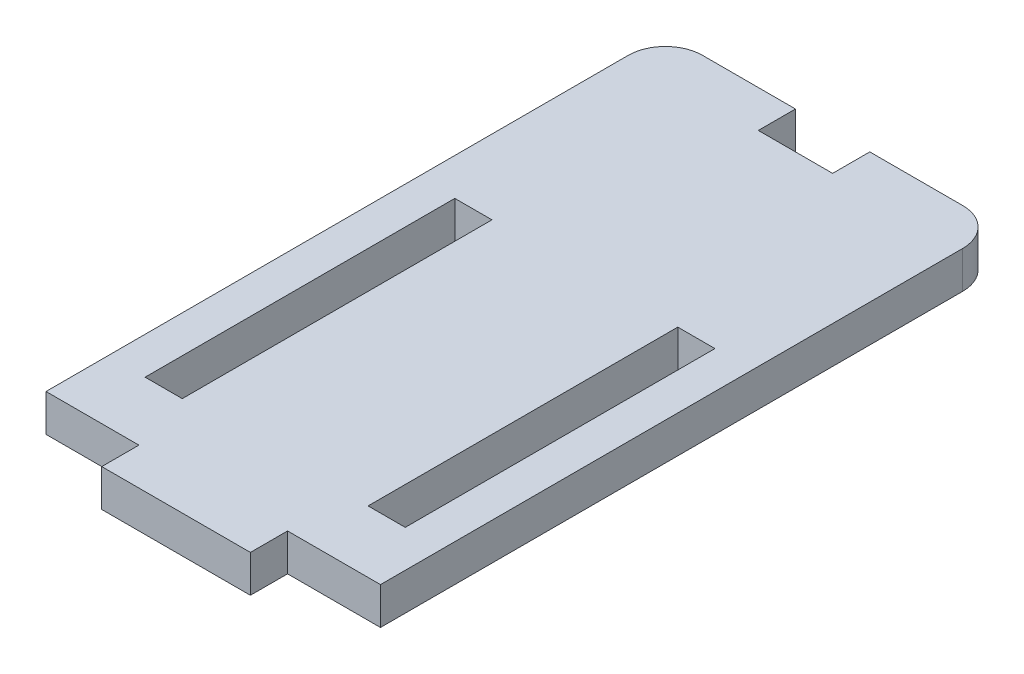
ISO-10303-21;
HEADER;
FILE_DESCRIPTION(('STEP AP214'),'2;1');
FILE_NAME('part.step','',(''),(''),'','','');
FILE_SCHEMA(('AUTOMOTIVE_DESIGN { 1 0 10303 214 1 1 1 1 }'));
ENDSEC;
DATA;
#1=APPLICATION_CONTEXT('core data for automotive mechanical design processes');
#2=APPLICATION_PROTOCOL_DEFINITION('international standard','automotive_design',2000,#1);
#3=PRODUCT_CONTEXT('',#1,'mechanical');
#4=PRODUCT('Part','Part','',(#3));
#5=PRODUCT_RELATED_PRODUCT_CATEGORY('part','',(#4));
#6=PRODUCT_DEFINITION_FORMATION('','',#4);
#7=PRODUCT_DEFINITION_CONTEXT('part definition',#1,'design');
#8=PRODUCT_DEFINITION('design','',#6,#7);
#9=PRODUCT_DEFINITION_SHAPE('','',#8);
#10=(LENGTH_UNIT() NAMED_UNIT(*) SI_UNIT(.MILLI.,.METRE.));
#11=(NAMED_UNIT(*) PLANE_ANGLE_UNIT() SI_UNIT($,.RADIAN.));
#12=(NAMED_UNIT(*) SI_UNIT($,.STERADIAN.) SOLID_ANGLE_UNIT());
#13=UNCERTAINTY_MEASURE_WITH_UNIT(LENGTH_MEASURE(1.E-05),#10,'distance_accuracy_value','');
#14=(GEOMETRIC_REPRESENTATION_CONTEXT(3) GLOBAL_UNCERTAINTY_ASSIGNED_CONTEXT((#13)) GLOBAL_UNIT_ASSIGNED_CONTEXT((#10,
#11,#12)) REPRESENTATION_CONTEXT('',''));
#15=CARTESIAN_POINT('',(0.,0.,0.));
#16=DIRECTION('',(0.,0.,1.));
#17=DIRECTION('',(1.,0.,0.));
#18=AXIS2_PLACEMENT_3D('',#15,#16,#17);
#19=CARTESIAN_POINT('',(-13.5,1.5,-25.));
#20=DIRECTION('',(0.,0.,1.));
#21=DIRECTION('',(1.,0.,0.));
#22=AXIS2_PLACEMENT_3D('',#19,#20,#21);
#23=PLANE('',#22);
#24=DIRECTION('',(-1.,0.,0.));
#25=VECTOR('',#24,1.);
#26=CARTESIAN_POINT('',(-13.5,1.5,-25.));
#27=LINE('',#26,#25);
#28=CARTESIAN_POINT('',(-3.,1.5,-25.));
#29=VERTEX_POINT('',#28);
#30=CARTESIAN_POINT('',(-10.5,1.5,-25.));
#31=VERTEX_POINT('',#30);
#32=EDGE_CURVE('E377',#29,#31,#27,.T.);
#33=ORIENTED_EDGE('',*,*,#32,.F.);
#34=DIRECTION('',(0.,1.,0.));
#35=VECTOR('',#34,1.);
#36=CARTESIAN_POINT('',(-3.,-1.5,-25.));
#37=LINE('',#36,#35);
#38=CARTESIAN_POINT('',(-3.,-1.5,-25.));
#39=VERTEX_POINT('',#38);
#40=EDGE_CURVE('E212',#39,#29,#37,.T.);
#41=ORIENTED_EDGE('',*,*,#40,.F.);
#42=DIRECTION('',(-1.,0.,0.));
#43=VECTOR('',#42,1.);
#44=CARTESIAN_POINT('',(-13.5,-1.5,-25.));
#45=LINE('',#44,#43);
#46=CARTESIAN_POINT('',(-10.5,-1.5,-25.));
#47=VERTEX_POINT('',#46);
#48=EDGE_CURVE('E393',#39,#47,#45,.T.);
#49=ORIENTED_EDGE('',*,*,#48,.T.);
#50=DIRECTION('',(0.,-1.,0.));
#51=VECTOR('',#50,1.);
#52=CARTESIAN_POINT('',(-10.5,1.5,-25.));
#53=LINE('',#52,#51);
#54=EDGE_CURVE('E404',#47,#31,#53,.F.);
#55=ORIENTED_EDGE('',*,*,#54,.T.);
#56=EDGE_LOOP('',(#33,#41,#49,#55));
#57=FACE_BOUND('',#56,.T.);
#58=ADVANCED_FACE('F45',(#57),#23,.F.);
#59=CARTESIAN_POINT('',(-13.5,1.5,25.));
#60=DIRECTION('',(0.,0.,-1.));
#61=DIRECTION('',(-1.,0.,0.));
#62=AXIS2_PLACEMENT_3D('',#59,#60,#61);
#63=PLANE('',#62);
#64=DIRECTION('',(0.,-1.,0.));
#65=VECTOR('',#64,1.);
#66=CARTESIAN_POINT('',(-6.0000000000001,1.5,25.));
#67=LINE('',#66,#65);
#68=CARTESIAN_POINT('',(-6.0000000000001,1.5,25.));
#69=VERTEX_POINT('',#68);
#70=CARTESIAN_POINT('',(-6.0000000000001,-1.5,25.));
#71=VERTEX_POINT('',#70);
#72=EDGE_CURVE('E340',#69,#71,#67,.T.);
#73=ORIENTED_EDGE('',*,*,#72,.F.);
#74=DIRECTION('',(1.,0.,0.));
#75=VECTOR('',#74,1.);
#76=CARTESIAN_POINT('',(-13.5,1.5,25.));
#77=LINE('',#76,#75);
#78=CARTESIAN_POINT('',(-13.5,1.5,25.));
#79=VERTEX_POINT('',#78);
#80=EDGE_CURVE('E369',#79,#69,#77,.T.);
#81=ORIENTED_EDGE('',*,*,#80,.F.);
#82=DIRECTION('',(0.,-1.,0.));
#83=VECTOR('',#82,1.);
#84=CARTESIAN_POINT('',(-13.5,1.5,25.));
#85=LINE('',#84,#83);
#86=CARTESIAN_POINT('',(-13.5,-1.5,25.));
#87=VERTEX_POINT('',#86);
#88=EDGE_CURVE('E400',#79,#87,#85,.T.);
#89=ORIENTED_EDGE('',*,*,#88,.T.);
#90=DIRECTION('',(1.,0.,0.));
#91=VECTOR('',#90,1.);
#92=CARTESIAN_POINT('',(-13.5,-1.5,25.));
#93=LINE('',#92,#91);
#94=EDGE_CURVE('E385',#87,#71,#93,.T.);
#95=ORIENTED_EDGE('',*,*,#94,.T.);
#96=EDGE_LOOP('',(#73,#81,#89,#95));
#97=FACE_BOUND('',#96,.T.);
#98=ADVANCED_FACE('F465',(#97),#63,.F.);
#99=CARTESIAN_POINT('',(-13.5,1.5,-25.));
#100=DIRECTION('',(1.,0.,0.));
#101=DIRECTION('',(0.,0.,-1.));
#102=AXIS2_PLACEMENT_3D('',#99,#100,#101);
#103=PLANE('',#102);
#104=DIRECTION('',(0.,0.,1.));
#105=VECTOR('',#104,1.);
#106=CARTESIAN_POINT('',(-13.5,1.5,-25.));
#107=LINE('',#106,#105);
#108=CARTESIAN_POINT('',(-13.5,1.5,-22.));
#109=VERTEX_POINT('',#108);
#110=EDGE_CURVE('E364',#109,#79,#107,.T.);
#111=ORIENTED_EDGE('',*,*,#110,.F.);
#112=DIRECTION('',(0.,-1.,0.));
#113=VECTOR('',#112,1.);
#114=CARTESIAN_POINT('',(-13.5,1.5,-22.));
#115=LINE('',#114,#113);
#116=CARTESIAN_POINT('',(-13.5,-1.5,-22.));
#117=VERTEX_POINT('',#116);
#118=EDGE_CURVE('E11',#109,#117,#115,.T.);
#119=ORIENTED_EDGE('',*,*,#118,.T.);
#120=DIRECTION('',(0.,0.,1.));
#121=VECTOR('',#120,1.);
#122=CARTESIAN_POINT('',(-13.5,-1.5,-25.));
#123=LINE('',#122,#121);
#124=EDGE_CURVE('E363',#117,#87,#123,.T.);
#125=ORIENTED_EDGE('',*,*,#124,.T.);
#126=ORIENTED_EDGE('',*,*,#88,.F.);
#127=EDGE_LOOP('',(#111,#119,#125,#126));
#128=FACE_BOUND('',#127,.T.);
#129=ADVANCED_FACE('F458',(#128),#103,.F.);
#130=CARTESIAN_POINT('',(6.0000000000001,1.5,25.));
#131=VERTEX_POINT('',#130);
#132=CARTESIAN_POINT('',(13.5,1.5,25.));
#133=VERTEX_POINT('',#132);
#134=EDGE_CURVE('E367',#131,#133,#77,.T.);
#135=ORIENTED_EDGE('',*,*,#134,.F.);
#136=DIRECTION('',(0.,-1.,0.));
#137=VECTOR('',#136,1.);
#138=CARTESIAN_POINT('',(6.0000000000001,1.5,25.));
#139=LINE('',#138,#137);
#140=CARTESIAN_POINT('',(6.0000000000001,-1.5,25.));
#141=VERTEX_POINT('',#140);
#142=EDGE_CURVE('E351',#131,#141,#139,.T.);
#143=ORIENTED_EDGE('',*,*,#142,.T.);
#144=CARTESIAN_POINT('',(13.5,-1.5,25.));
#145=VERTEX_POINT('',#144);
#146=EDGE_CURVE('E384',#141,#145,#93,.T.);
#147=ORIENTED_EDGE('',*,*,#146,.T.);
#148=DIRECTION('',(0.,-1.,0.));
#149=VECTOR('',#148,1.);
#150=CARTESIAN_POINT('',(13.5,1.5,25.));
#151=LINE('',#150,#149);
#152=EDGE_CURVE('E381',#133,#145,#151,.T.);
#153=ORIENTED_EDGE('',*,*,#152,.F.);
#154=EDGE_LOOP('',(#135,#143,#147,#153));
#155=FACE_BOUND('',#154,.T.);
#156=ADVANCED_FACE('F445',(#155),#63,.F.);
#157=CARTESIAN_POINT('',(13.5,1.5,-25.));
#158=DIRECTION('',(-1.,0.,0.));
#159=DIRECTION('',(0.,0.,1.));
#160=AXIS2_PLACEMENT_3D('',#157,#158,#159);
#161=PLANE('',#160);
#162=DIRECTION('',(0.,0.,-1.));
#163=VECTOR('',#162,1.);
#164=CARTESIAN_POINT('',(13.5,-1.5,-25.));
#165=LINE('',#164,#163);
#166=CARTESIAN_POINT('',(13.5,-1.5,-22.));
#167=VERTEX_POINT('',#166);
#168=EDGE_CURVE('E389',#145,#167,#165,.T.);
#169=ORIENTED_EDGE('',*,*,#168,.T.);
#170=DIRECTION('',(0.,-1.,0.));
#171=VECTOR('',#170,1.);
#172=CARTESIAN_POINT('',(13.5,1.5,-22.));
#173=LINE('',#172,#171);
#174=CARTESIAN_POINT('',(13.5,1.5,-22.));
#175=VERTEX_POINT('',#174);
#176=EDGE_CURVE('E419',#167,#175,#173,.F.);
#177=ORIENTED_EDGE('',*,*,#176,.T.);
#178=DIRECTION('',(0.,0.,-1.));
#179=VECTOR('',#178,1.);
#180=CARTESIAN_POINT('',(13.5,1.5,-25.));
#181=LINE('',#180,#179);
#182=EDGE_CURVE('E373',#133,#175,#181,.T.);
#183=ORIENTED_EDGE('',*,*,#182,.F.);
#184=ORIENTED_EDGE('',*,*,#152,.T.);
#185=EDGE_LOOP('',(#169,#177,#183,#184));
#186=FACE_BOUND('',#185,.T.);
#187=ADVANCED_FACE('F441',(#186),#161,.F.);
#188=CARTESIAN_POINT('',(10.5,-1.5,-25.));
#189=VERTEX_POINT('',#188);
#190=CARTESIAN_POINT('',(3.,-1.5,-25.));
#191=VERTEX_POINT('',#190);
#192=EDGE_CURVE('E368',#189,#191,#45,.T.);
#193=ORIENTED_EDGE('',*,*,#192,.T.);
#194=DIRECTION('',(0.,1.,0.));
#195=VECTOR('',#194,1.);
#196=CARTESIAN_POINT('',(3.,-1.5,-25.));
#197=LINE('',#196,#195);
#198=CARTESIAN_POINT('',(3.,1.5,-25.));
#199=VERTEX_POINT('',#198);
#200=EDGE_CURVE('E235',#191,#199,#197,.T.);
#201=ORIENTED_EDGE('',*,*,#200,.T.);
#202=CARTESIAN_POINT('',(10.5,1.5,-25.));
#203=VERTEX_POINT('',#202);
#204=EDGE_CURVE('E378',#203,#199,#27,.T.);
#205=ORIENTED_EDGE('',*,*,#204,.F.);
#206=DIRECTION('',(0.,-1.,0.));
#207=VECTOR('',#206,1.);
#208=CARTESIAN_POINT('',(10.5,1.5,-25.));
#209=LINE('',#208,#207);
#210=EDGE_CURVE('E408',#203,#189,#209,.T.);
#211=ORIENTED_EDGE('',*,*,#210,.T.);
#212=EDGE_LOOP('',(#193,#201,#205,#211));
#213=FACE_BOUND('',#212,.T.);
#214=ADVANCED_FACE('F431',(#213),#23,.F.);
#215=CARTESIAN_POINT('',(0.,1.5,0.));
#216=DIRECTION('',(0.,1.,0.));
#217=DIRECTION('',(0.,0.,1.));
#218=AXIS2_PLACEMENT_3D('',#215,#216,#217);
#219=PLANE('',#218);
#220=DIRECTION('',(0.,0.,1.));
#221=VECTOR('',#220,1.);
#222=CARTESIAN_POINT('',(-3.,1.5,-25.));
#223=LINE('',#222,#221);
#224=CARTESIAN_POINT('',(-3.,1.5,-22.));
#225=VERTEX_POINT('',#224);
#226=EDGE_CURVE('E209',#29,#225,#223,.T.);
#227=ORIENTED_EDGE('',*,*,#226,.F.);
#228=ORIENTED_EDGE('',*,*,#32,.T.);
#229=CARTESIAN_POINT('',(-10.5,1.5,-22.));
#230=DIRECTION('',(0.,1.,0.));
#231=DIRECTION('',(0.,0.,1.));
#232=AXIS2_PLACEMENT_3D('',#229,#230,#231);
#233=CIRCLE('',#232,3.);
#234=EDGE_CURVE('E69',#31,#109,#233,.T.);
#235=ORIENTED_EDGE('',*,*,#234,.T.);
#236=ORIENTED_EDGE('',*,*,#110,.T.);
#237=ORIENTED_EDGE('',*,*,#80,.T.);
#238=DIRECTION('',(0.,0.,1.));
#239=VECTOR('',#238,1.);
#240=CARTESIAN_POINT('',(-6.0000000000001,1.5,25.));
#241=LINE('',#240,#239);
#242=CARTESIAN_POINT('',(-6.0000000000001,1.5,28.));
#243=VERTEX_POINT('',#242);
#244=EDGE_CURVE('E329',#69,#243,#241,.T.);
#245=ORIENTED_EDGE('',*,*,#244,.T.);
#246=DIRECTION('',(1.,0.,0.));
#247=VECTOR('',#246,1.);
#248=CARTESIAN_POINT('',(-6.0000000000001,1.5,28.));
#249=LINE('',#248,#247);
#250=CARTESIAN_POINT('',(5.9999999999999,1.5,28.));
#251=VERTEX_POINT('',#250);
#252=EDGE_CURVE('E333',#243,#251,#249,.T.);
#253=ORIENTED_EDGE('',*,*,#252,.T.);
#254=DIRECTION('',(0.,0.,-1.));
#255=VECTOR('',#254,1.);
#256=CARTESIAN_POINT('',(6.0000000000001,1.5,25.));
#257=LINE('',#256,#255);
#258=EDGE_CURVE('E337',#251,#131,#257,.T.);
#259=ORIENTED_EDGE('',*,*,#258,.T.);
#260=ORIENTED_EDGE('',*,*,#134,.T.);
#261=ORIENTED_EDGE('',*,*,#182,.T.);
#262=CARTESIAN_POINT('',(10.5,1.5,-22.));
#263=DIRECTION('',(0.,1.,0.));
#264=DIRECTION('',(0.,0.,1.));
#265=AXIS2_PLACEMENT_3D('',#262,#263,#264);
#266=CIRCLE('',#265,3.);
#267=EDGE_CURVE('E54',#175,#203,#266,.T.);
#268=ORIENTED_EDGE('',*,*,#267,.T.);
#269=ORIENTED_EDGE('',*,*,#204,.T.);
#270=DIRECTION('',(0.,0.,-1.));
#271=VECTOR('',#270,1.);
#272=CARTESIAN_POINT('',(3.,1.5,-25.));
#273=LINE('',#272,#271);
#274=CARTESIAN_POINT('',(3.,1.5,-22.));
#275=VERTEX_POINT('',#274);
#276=EDGE_CURVE('E219',#275,#199,#273,.T.);
#277=ORIENTED_EDGE('',*,*,#276,.F.);
#278=DIRECTION('',(1.,0.,0.));
#279=VECTOR('',#278,1.);
#280=CARTESIAN_POINT('',(-3.,1.5,-22.));
#281=LINE('',#280,#279);
#282=EDGE_CURVE('E199',#225,#275,#281,.T.);
#283=ORIENTED_EDGE('',*,*,#282,.F.);
#284=EDGE_LOOP('',(#227,#228,#235,#236,#237,#245,#253,#259,#260,#261,#268,#269,#277,#283));
#285=FACE_BOUND('',#284,.T.);
#286=DIRECTION('',(0.,0.,1.));
#287=VECTOR('',#286,1.);
#288=CARTESIAN_POINT('',(-10.5,1.5,-5.));
#289=LINE('',#288,#287);
#290=CARTESIAN_POINT('',(-10.5,1.5,-5.));
#291=VERTEX_POINT('',#290);
#292=CARTESIAN_POINT('',(-10.5,1.5,20.));
#293=VERTEX_POINT('',#292);
#294=EDGE_CURVE('E241',#291,#293,#289,.T.);
#295=ORIENTED_EDGE('',*,*,#294,.F.);
#296=DIRECTION('',(-1.,0.,0.));
#297=VECTOR('',#296,1.);
#298=CARTESIAN_POINT('',(-10.5,1.5,-5.));
#299=LINE('',#298,#297);
#300=CARTESIAN_POINT('',(-7.5,1.5,-5.));
#301=VERTEX_POINT('',#300);
#302=EDGE_CURVE('E253',#301,#291,#299,.T.);
#303=ORIENTED_EDGE('',*,*,#302,.F.);
#304=DIRECTION('',(0.,0.,-1.));
#305=VECTOR('',#304,1.);
#306=CARTESIAN_POINT('',(-7.5,1.5,-5.));
#307=LINE('',#306,#305);
#308=CARTESIAN_POINT('',(-7.5,1.5,20.));
#309=VERTEX_POINT('',#308);
#310=EDGE_CURVE('E249',#309,#301,#307,.T.);
#311=ORIENTED_EDGE('',*,*,#310,.F.);
#312=DIRECTION('',(1.,0.,0.));
#313=VECTOR('',#312,1.);
#314=CARTESIAN_POINT('',(-10.5,1.5,20.));
#315=LINE('',#314,#313);
#316=EDGE_CURVE('E244',#293,#309,#315,.T.);
#317=ORIENTED_EDGE('',*,*,#316,.F.);
#318=EDGE_LOOP('',(#295,#303,#311,#317));
#319=FACE_BOUND('',#318,.T.);
#320=DIRECTION('',(-1.,0.,0.));
#321=VECTOR('',#320,1.);
#322=CARTESIAN_POINT('',(10.5,1.5,-5.));
#323=LINE('',#322,#321);
#324=CARTESIAN_POINT('',(10.5,1.5,-5.));
#325=VERTEX_POINT('',#324);
#326=CARTESIAN_POINT('',(7.5,1.5,-5.));
#327=VERTEX_POINT('',#326);
#328=EDGE_CURVE('E234',#325,#327,#323,.T.);
#329=ORIENTED_EDGE('',*,*,#328,.F.);
#330=DIRECTION('',(0.,0.,-1.));
#331=VECTOR('',#330,1.);
#332=CARTESIAN_POINT('',(10.5,1.5,-5.));
#333=LINE('',#332,#331);
#334=CARTESIAN_POINT('',(10.5,1.5,20.));
#335=VERTEX_POINT('',#334);
#336=EDGE_CURVE('E297',#335,#325,#333,.T.);
#337=ORIENTED_EDGE('',*,*,#336,.F.);
#338=DIRECTION('',(1.,0.,0.));
#339=VECTOR('',#338,1.);
#340=CARTESIAN_POINT('',(10.5,1.5,20.));
#341=LINE('',#340,#339);
#342=CARTESIAN_POINT('',(7.5,1.5,20.));
#343=VERTEX_POINT('',#342);
#344=EDGE_CURVE('E293',#343,#335,#341,.T.);
#345=ORIENTED_EDGE('',*,*,#344,.F.);
#346=DIRECTION('',(0.,0.,1.));
#347=VECTOR('',#346,1.);
#348=CARTESIAN_POINT('',(7.5,1.5,-5.));
#349=LINE('',#348,#347);
#350=EDGE_CURVE('E289',#327,#343,#349,.T.);
#351=ORIENTED_EDGE('',*,*,#350,.F.);
#352=EDGE_LOOP('',(#329,#337,#345,#351));
#353=FACE_BOUND('',#352,.T.);
#354=ADVANCED_FACE('F216',(#285,#319,#353),#219,.T.);
#355=CARTESIAN_POINT('',(0.,-1.5,0.));
#356=DIRECTION('',(0.,1.,0.));
#357=DIRECTION('',(0.,0.,1.));
#358=AXIS2_PLACEMENT_3D('',#355,#356,#357);
#359=PLANE('',#358);
#360=ORIENTED_EDGE('',*,*,#48,.F.);
#361=DIRECTION('',(0.,0.,1.));
#362=VECTOR('',#361,1.);
#363=CARTESIAN_POINT('',(-3.,-1.5,-25.));
#364=LINE('',#363,#362);
#365=CARTESIAN_POINT('',(-3.,-1.5,-22.));
#366=VERTEX_POINT('',#365);
#367=EDGE_CURVE('E223',#39,#366,#364,.T.);
#368=ORIENTED_EDGE('',*,*,#367,.T.);
#369=DIRECTION('',(1.,0.,0.));
#370=VECTOR('',#369,1.);
#371=CARTESIAN_POINT('',(-3.,-1.5,-22.));
#372=LINE('',#371,#370);
#373=CARTESIAN_POINT('',(3.,-1.5,-22.));
#374=VERTEX_POINT('',#373);
#375=EDGE_CURVE('E202',#366,#374,#372,.T.);
#376=ORIENTED_EDGE('',*,*,#375,.T.);
#377=DIRECTION('',(0.,0.,-1.));
#378=VECTOR('',#377,1.);
#379=CARTESIAN_POINT('',(3.,-1.5,-25.));
#380=LINE('',#379,#378);
#381=EDGE_CURVE('E61',#374,#191,#380,.T.);
#382=ORIENTED_EDGE('',*,*,#381,.T.);
#383=ORIENTED_EDGE('',*,*,#192,.F.);
#384=CARTESIAN_POINT('',(10.5,-1.5,-22.));
#385=DIRECTION('',(0.,1.,0.));
#386=DIRECTION('',(0.,0.,1.));
#387=AXIS2_PLACEMENT_3D('',#384,#385,#386);
#388=CIRCLE('',#387,3.);
#389=EDGE_CURVE('E416',#189,#167,#388,.F.);
#390=ORIENTED_EDGE('',*,*,#389,.T.);
#391=ORIENTED_EDGE('',*,*,#168,.F.);
#392=ORIENTED_EDGE('',*,*,#146,.F.);
#393=DIRECTION('',(0.,0.,-1.));
#394=VECTOR('',#393,1.);
#395=CARTESIAN_POINT('',(6.0000000000001,-1.5,25.));
#396=LINE('',#395,#394);
#397=CARTESIAN_POINT('',(5.9999999999999,-1.5,28.));
#398=VERTEX_POINT('',#397);
#399=EDGE_CURVE('E334',#398,#141,#396,.T.);
#400=ORIENTED_EDGE('',*,*,#399,.F.);
#401=DIRECTION('',(1.,0.,0.));
#402=VECTOR('',#401,1.);
#403=CARTESIAN_POINT('',(-6.0000000000001,-1.5,28.));
#404=LINE('',#403,#402);
#405=CARTESIAN_POINT('',(-6.0000000000001,-1.5,28.));
#406=VERTEX_POINT('',#405);
#407=EDGE_CURVE('E344',#406,#398,#404,.T.);
#408=ORIENTED_EDGE('',*,*,#407,.F.);
#409=DIRECTION('',(0.,0.,1.));
#410=VECTOR('',#409,1.);
#411=CARTESIAN_POINT('',(-6.0000000000001,-1.5,25.));
#412=LINE('',#411,#410);
#413=EDGE_CURVE('E277',#71,#406,#412,.T.);
#414=ORIENTED_EDGE('',*,*,#413,.F.);
#415=ORIENTED_EDGE('',*,*,#94,.F.);
#416=ORIENTED_EDGE('',*,*,#124,.F.);
#417=CARTESIAN_POINT('',(-10.5,-1.5,-22.));
#418=DIRECTION('',(0.,1.,0.));
#419=DIRECTION('',(0.,0.,1.));
#420=AXIS2_PLACEMENT_3D('',#417,#418,#419);
#421=CIRCLE('',#420,3.);
#422=EDGE_CURVE('E412',#117,#47,#421,.F.);
#423=ORIENTED_EDGE('',*,*,#422,.T.);
#424=EDGE_LOOP('',(#360,#368,#376,#382,#383,#390,#391,#392,#400,#408,#414,#415,#416,#423));
#425=FACE_BOUND('',#424,.T.);
#426=DIRECTION('',(-1.,0.,0.));
#427=VECTOR('',#426,1.);
#428=CARTESIAN_POINT('',(-10.5,-1.5,-5.));
#429=LINE('',#428,#427);
#430=CARTESIAN_POINT('',(-7.5,-1.5,-5.));
#431=VERTEX_POINT('',#430);
#432=CARTESIAN_POINT('',(-10.5,-1.5,-5.));
#433=VERTEX_POINT('',#432);
#434=EDGE_CURVE('E269',#431,#433,#429,.T.);
#435=ORIENTED_EDGE('',*,*,#434,.T.);
#436=DIRECTION('',(0.,0.,1.));
#437=VECTOR('',#436,1.);
#438=CARTESIAN_POINT('',(-10.5,-1.5,-5.));
#439=LINE('',#438,#437);
#440=CARTESIAN_POINT('',(-10.5,-1.5,20.));
#441=VERTEX_POINT('',#440);
#442=EDGE_CURVE('E257',#433,#441,#439,.T.);
#443=ORIENTED_EDGE('',*,*,#442,.T.);
#444=DIRECTION('',(1.,0.,0.));
#445=VECTOR('',#444,1.);
#446=CARTESIAN_POINT('',(-10.5,-1.5,20.));
#447=LINE('',#446,#445);
#448=CARTESIAN_POINT('',(-7.5,-1.5,20.));
#449=VERTEX_POINT('',#448);
#450=EDGE_CURVE('E261',#441,#449,#447,.T.);
#451=ORIENTED_EDGE('',*,*,#450,.T.);
#452=DIRECTION('',(0.,0.,-1.));
#453=VECTOR('',#452,1.);
#454=CARTESIAN_POINT('',(-7.5,-1.5,-5.));
#455=LINE('',#454,#453);
#456=EDGE_CURVE('E265',#449,#431,#455,.T.);
#457=ORIENTED_EDGE('',*,*,#456,.T.);
#458=EDGE_LOOP('',(#435,#443,#451,#457));
#459=FACE_BOUND('',#458,.T.);
#460=DIRECTION('',(0.,0.,-1.));
#461=VECTOR('',#460,1.);
#462=CARTESIAN_POINT('',(10.5,-1.5,-5.));
#463=LINE('',#462,#461);
#464=CARTESIAN_POINT('',(10.5,-1.5,20.));
#465=VERTEX_POINT('',#464);
#466=CARTESIAN_POINT('',(10.5,-1.5,-5.));
#467=VERTEX_POINT('',#466);
#468=EDGE_CURVE('E313',#465,#467,#463,.T.);
#469=ORIENTED_EDGE('',*,*,#468,.T.);
#470=DIRECTION('',(-1.,0.,0.));
#471=VECTOR('',#470,1.);
#472=CARTESIAN_POINT('',(10.5,-1.5,-5.));
#473=LINE('',#472,#471);
#474=CARTESIAN_POINT('',(7.5,-1.5,-5.));
#475=VERTEX_POINT('',#474);
#476=EDGE_CURVE('E301',#467,#475,#473,.T.);
#477=ORIENTED_EDGE('',*,*,#476,.T.);
#478=DIRECTION('',(0.,0.,1.));
#479=VECTOR('',#478,1.);
#480=CARTESIAN_POINT('',(7.5,-1.5,-5.));
#481=LINE('',#480,#479);
#482=CARTESIAN_POINT('',(7.5,-1.5,20.));
#483=VERTEX_POINT('',#482);
#484=EDGE_CURVE('E305',#475,#483,#481,.T.);
#485=ORIENTED_EDGE('',*,*,#484,.T.);
#486=DIRECTION('',(1.,0.,0.));
#487=VECTOR('',#486,1.);
#488=CARTESIAN_POINT('',(10.5,-1.5,20.));
#489=LINE('',#488,#487);
#490=EDGE_CURVE('E309',#483,#465,#489,.T.);
#491=ORIENTED_EDGE('',*,*,#490,.T.);
#492=EDGE_LOOP('',(#469,#477,#485,#491));
#493=FACE_BOUND('',#492,.T.);
#494=ADVANCED_FACE('F437',(#425,#459,#493),#359,.F.);
#495=CARTESIAN_POINT('',(-6.0000000000001,1.5,25.));
#496=DIRECTION('',(1.,0.,0.));
#497=DIRECTION('',(0.,0.,-1.));
#498=AXIS2_PLACEMENT_3D('',#495,#496,#497);
#499=PLANE('',#498);
#500=ORIENTED_EDGE('',*,*,#413,.T.);
#501=DIRECTION('',(0.,-1.,0.));
#502=VECTOR('',#501,1.);
#503=CARTESIAN_POINT('',(-6.0000000000001,1.5,28.));
#504=LINE('',#503,#502);
#505=EDGE_CURVE('E359',#243,#406,#504,.T.);
#506=ORIENTED_EDGE('',*,*,#505,.F.);
#507=ORIENTED_EDGE('',*,*,#244,.F.);
#508=ORIENTED_EDGE('',*,*,#72,.T.);
#509=EDGE_LOOP('',(#500,#506,#507,#508));
#510=FACE_BOUND('',#509,.T.);
#511=ADVANCED_FACE('F469',(#510),#499,.F.);
#512=CARTESIAN_POINT('',(-6.0000000000001,1.5,28.));
#513=DIRECTION('',(0.,0.,-1.));
#514=DIRECTION('',(-1.,0.,0.));
#515=AXIS2_PLACEMENT_3D('',#512,#513,#514);
#516=PLANE('',#515);
#517=ORIENTED_EDGE('',*,*,#407,.T.);
#518=DIRECTION('',(0.,-1.,0.));
#519=VECTOR('',#518,1.);
#520=CARTESIAN_POINT('',(5.9999999999999,1.5,28.));
#521=LINE('',#520,#519);
#522=EDGE_CURVE('E355',#251,#398,#521,.T.);
#523=ORIENTED_EDGE('',*,*,#522,.F.);
#524=ORIENTED_EDGE('',*,*,#252,.F.);
#525=ORIENTED_EDGE('',*,*,#505,.T.);
#526=EDGE_LOOP('',(#517,#523,#524,#525));
#527=FACE_BOUND('',#526,.T.);
#528=ADVANCED_FACE('F471',(#527),#516,.F.);
#529=CARTESIAN_POINT('',(6.0000000000001,1.5,25.));
#530=DIRECTION('',(-1.,0.,0.));
#531=DIRECTION('',(0.,0.,1.));
#532=AXIS2_PLACEMENT_3D('',#529,#530,#531);
#533=PLANE('',#532);
#534=ORIENTED_EDGE('',*,*,#399,.T.);
#535=ORIENTED_EDGE('',*,*,#142,.F.);
#536=ORIENTED_EDGE('',*,*,#258,.F.);
#537=ORIENTED_EDGE('',*,*,#522,.T.);
#538=EDGE_LOOP('',(#534,#535,#536,#537));
#539=FACE_BOUND('',#538,.T.);
#540=ADVANCED_FACE('F474',(#539),#533,.F.);
#541=CARTESIAN_POINT('',(10.5,-1.5,-5.));
#542=DIRECTION('',(0.,0.,-1.));
#543=DIRECTION('',(-1.,0.,0.));
#544=AXIS2_PLACEMENT_3D('',#541,#542,#543);
#545=PLANE('',#544);
#546=DIRECTION('',(0.,1.,0.));
#547=VECTOR('',#546,1.);
#548=CARTESIAN_POINT('',(7.5,-1.5,-5.));
#549=LINE('',#548,#547);
#550=EDGE_CURVE('E317',#475,#327,#549,.T.);
#551=ORIENTED_EDGE('',*,*,#550,.F.);
#552=ORIENTED_EDGE('',*,*,#476,.F.);
#553=DIRECTION('',(0.,1.,0.));
#554=VECTOR('',#553,1.);
#555=CARTESIAN_POINT('',(10.5,-1.5,-5.));
#556=LINE('',#555,#554);
#557=EDGE_CURVE('E245',#467,#325,#556,.T.);
#558=ORIENTED_EDGE('',*,*,#557,.T.);
#559=ORIENTED_EDGE('',*,*,#328,.T.);
#560=EDGE_LOOP('',(#551,#552,#558,#559));
#561=FACE_BOUND('',#560,.T.);
#562=ADVANCED_FACE('F476',(#561),#545,.F.);
#563=CARTESIAN_POINT('',(10.5,-1.5,-5.));
#564=DIRECTION('',(1.,0.,0.));
#565=DIRECTION('',(0.,0.,-1.));
#566=AXIS2_PLACEMENT_3D('',#563,#564,#565);
#567=PLANE('',#566);
#568=ORIENTED_EDGE('',*,*,#557,.F.);
#569=ORIENTED_EDGE('',*,*,#468,.F.);
#570=DIRECTION('',(0.,1.,0.));
#571=VECTOR('',#570,1.);
#572=CARTESIAN_POINT('',(10.5,-1.5,20.));
#573=LINE('',#572,#571);
#574=EDGE_CURVE('E320',#465,#335,#573,.T.);
#575=ORIENTED_EDGE('',*,*,#574,.T.);
#576=ORIENTED_EDGE('',*,*,#336,.T.);
#577=EDGE_LOOP('',(#568,#569,#575,#576));
#578=FACE_BOUND('',#577,.T.);
#579=ADVANCED_FACE('F482',(#578),#567,.F.);
#580=CARTESIAN_POINT('',(10.5,-1.5,20.));
#581=DIRECTION('',(0.,0.,1.));
#582=DIRECTION('',(1.,0.,0.));
#583=AXIS2_PLACEMENT_3D('',#580,#581,#582);
#584=PLANE('',#583);
#585=ORIENTED_EDGE('',*,*,#574,.F.);
#586=ORIENTED_EDGE('',*,*,#490,.F.);
#587=DIRECTION('',(0.,1.,0.));
#588=VECTOR('',#587,1.);
#589=CARTESIAN_POINT('',(7.5,-1.5,20.));
#590=LINE('',#589,#588);
#591=EDGE_CURVE('E323',#483,#343,#590,.T.);
#592=ORIENTED_EDGE('',*,*,#591,.T.);
#593=ORIENTED_EDGE('',*,*,#344,.T.);
#594=EDGE_LOOP('',(#585,#586,#592,#593));
#595=FACE_BOUND('',#594,.T.);
#596=ADVANCED_FACE('F530',(#595),#584,.F.);
#597=CARTESIAN_POINT('',(7.5,-1.5,-5.));
#598=DIRECTION('',(-1.,0.,0.));
#599=DIRECTION('',(0.,0.,1.));
#600=AXIS2_PLACEMENT_3D('',#597,#598,#599);
#601=PLANE('',#600);
#602=ORIENTED_EDGE('',*,*,#591,.F.);
#603=ORIENTED_EDGE('',*,*,#484,.F.);
#604=ORIENTED_EDGE('',*,*,#550,.T.);
#605=ORIENTED_EDGE('',*,*,#350,.T.);
#606=EDGE_LOOP('',(#602,#603,#604,#605));
#607=FACE_BOUND('',#606,.T.);
#608=ADVANCED_FACE('F526',(#607),#601,.F.);
#609=CARTESIAN_POINT('',(-10.5,-1.5,-5.));
#610=DIRECTION('',(-1.,0.,0.));
#611=DIRECTION('',(0.,0.,1.));
#612=AXIS2_PLACEMENT_3D('',#609,#610,#611);
#613=PLANE('',#612);
#614=DIRECTION('',(0.,1.,0.));
#615=VECTOR('',#614,1.);
#616=CARTESIAN_POINT('',(-10.5,-1.5,20.));
#617=LINE('',#616,#615);
#618=EDGE_CURVE('E273',#441,#293,#617,.T.);
#619=ORIENTED_EDGE('',*,*,#618,.F.);
#620=ORIENTED_EDGE('',*,*,#442,.F.);
#621=DIRECTION('',(0.,1.,0.));
#622=VECTOR('',#621,1.);
#623=CARTESIAN_POINT('',(-10.5,-1.5,-5.));
#624=LINE('',#623,#622);
#625=EDGE_CURVE('E274',#433,#291,#624,.T.);
#626=ORIENTED_EDGE('',*,*,#625,.T.);
#627=ORIENTED_EDGE('',*,*,#294,.T.);
#628=EDGE_LOOP('',(#619,#620,#626,#627));
#629=FACE_BOUND('',#628,.T.);
#630=ADVANCED_FACE('F523',(#629),#613,.F.);
#631=CARTESIAN_POINT('',(-10.5,-1.5,-5.));
#632=DIRECTION('',(0.,0.,-1.));
#633=DIRECTION('',(-1.,0.,0.));
#634=AXIS2_PLACEMENT_3D('',#631,#632,#633);
#635=PLANE('',#634);
#636=ORIENTED_EDGE('',*,*,#625,.F.);
#637=ORIENTED_EDGE('',*,*,#434,.F.);
#638=DIRECTION('',(0.,1.,0.));
#639=VECTOR('',#638,1.);
#640=CARTESIAN_POINT('',(-7.5,-1.5,-5.));
#641=LINE('',#640,#639);
#642=EDGE_CURVE('E278',#431,#301,#641,.T.);
#643=ORIENTED_EDGE('',*,*,#642,.T.);
#644=ORIENTED_EDGE('',*,*,#302,.T.);
#645=EDGE_LOOP('',(#636,#637,#643,#644));
#646=FACE_BOUND('',#645,.T.);
#647=ADVANCED_FACE('F517',(#646),#635,.F.);
#648=CARTESIAN_POINT('',(-7.5,-1.5,-5.));
#649=DIRECTION('',(1.,0.,0.));
#650=DIRECTION('',(0.,0.,-1.));
#651=AXIS2_PLACEMENT_3D('',#648,#649,#650);
#652=PLANE('',#651);
#653=ORIENTED_EDGE('',*,*,#642,.F.);
#654=ORIENTED_EDGE('',*,*,#456,.F.);
#655=DIRECTION('',(0.,1.,0.));
#656=VECTOR('',#655,1.);
#657=CARTESIAN_POINT('',(-7.5,-1.5,20.));
#658=LINE('',#657,#656);
#659=EDGE_CURVE('E281',#449,#309,#658,.T.);
#660=ORIENTED_EDGE('',*,*,#659,.T.);
#661=ORIENTED_EDGE('',*,*,#310,.T.);
#662=EDGE_LOOP('',(#653,#654,#660,#661));
#663=FACE_BOUND('',#662,.T.);
#664=ADVANCED_FACE('F511',(#663),#652,.F.);
#665=CARTESIAN_POINT('',(-10.5,-1.5,20.));
#666=DIRECTION('',(0.,0.,1.));
#667=DIRECTION('',(1.,0.,0.));
#668=AXIS2_PLACEMENT_3D('',#665,#666,#667);
#669=PLANE('',#668);
#670=ORIENTED_EDGE('',*,*,#659,.F.);
#671=ORIENTED_EDGE('',*,*,#450,.F.);
#672=ORIENTED_EDGE('',*,*,#618,.T.);
#673=ORIENTED_EDGE('',*,*,#316,.T.);
#674=EDGE_LOOP('',(#670,#671,#672,#673));
#675=FACE_BOUND('',#674,.T.);
#676=ADVANCED_FACE('F507',(#675),#669,.F.);
#677=CARTESIAN_POINT('',(10.5,1.5,-22.));
#678=DIRECTION('',(0.,-1.,0.));
#679=DIRECTION('',(0.,0.,-1.));
#680=AXIS2_PLACEMENT_3D('',#677,#678,#679);
#681=CYLINDRICAL_SURFACE('',#680,3.);
#682=ORIENTED_EDGE('',*,*,#267,.F.);
#683=ORIENTED_EDGE('',*,*,#176,.F.);
#684=ORIENTED_EDGE('',*,*,#389,.F.);
#685=ORIENTED_EDGE('',*,*,#210,.F.);
#686=EDGE_LOOP('',(#682,#683,#684,#685));
#687=FACE_BOUND('',#686,.T.);
#688=ADVANCED_FACE('F433',(#687),#681,.T.);
#689=CARTESIAN_POINT('',(-10.5,1.5,-22.));
#690=DIRECTION('',(0.,-1.,0.));
#691=DIRECTION('',(0.,0.,-1.));
#692=AXIS2_PLACEMENT_3D('',#689,#690,#691);
#693=CYLINDRICAL_SURFACE('',#692,3.);
#694=ORIENTED_EDGE('',*,*,#234,.F.);
#695=ORIENTED_EDGE('',*,*,#54,.F.);
#696=ORIENTED_EDGE('',*,*,#422,.F.);
#697=ORIENTED_EDGE('',*,*,#118,.F.);
#698=EDGE_LOOP('',(#694,#695,#696,#697));
#699=FACE_BOUND('',#698,.T.);
#700=ADVANCED_FACE('F47',(#699),#693,.T.);
#701=CARTESIAN_POINT('',(-3.,-1.5,-25.));
#702=DIRECTION('',(-1.,0.,0.));
#703=DIRECTION('',(0.,0.,1.));
#704=AXIS2_PLACEMENT_3D('',#701,#702,#703);
#705=PLANE('',#704);
#706=DIRECTION('',(0.,1.,0.));
#707=VECTOR('',#706,1.);
#708=CARTESIAN_POINT('',(-3.,-1.5,-22.));
#709=LINE('',#708,#707);
#710=EDGE_CURVE('E195',#366,#225,#709,.T.);
#711=ORIENTED_EDGE('',*,*,#710,.F.);
#712=ORIENTED_EDGE('',*,*,#367,.F.);
#713=ORIENTED_EDGE('',*,*,#40,.T.);
#714=ORIENTED_EDGE('',*,*,#226,.T.);
#715=EDGE_LOOP('',(#711,#712,#713,#714));
#716=FACE_BOUND('',#715,.T.);
#717=ADVANCED_FACE('F210',(#716),#705,.F.);
#718=CARTESIAN_POINT('',(3.,-1.5,-25.));
#719=DIRECTION('',(1.,0.,0.));
#720=DIRECTION('',(0.,0.,-1.));
#721=AXIS2_PLACEMENT_3D('',#718,#719,#720);
#722=PLANE('',#721);
#723=ORIENTED_EDGE('',*,*,#200,.F.);
#724=ORIENTED_EDGE('',*,*,#381,.F.);
#725=DIRECTION('',(0.,1.,0.));
#726=VECTOR('',#725,1.);
#727=CARTESIAN_POINT('',(3.,-1.5,-22.));
#728=LINE('',#727,#726);
#729=EDGE_CURVE('E206',#374,#275,#728,.T.);
#730=ORIENTED_EDGE('',*,*,#729,.T.);
#731=ORIENTED_EDGE('',*,*,#276,.T.);
#732=EDGE_LOOP('',(#723,#724,#730,#731));
#733=FACE_BOUND('',#732,.T.);
#734=ADVANCED_FACE('F609',(#733),#722,.F.);
#735=CARTESIAN_POINT('',(-3.,-1.5,-22.));
#736=DIRECTION('',(0.,0.,1.));
#737=DIRECTION('',(1.,0.,0.));
#738=AXIS2_PLACEMENT_3D('',#735,#736,#737);
#739=PLANE('',#738);
#740=ORIENTED_EDGE('',*,*,#729,.F.);
#741=ORIENTED_EDGE('',*,*,#375,.F.);
#742=ORIENTED_EDGE('',*,*,#710,.T.);
#743=ORIENTED_EDGE('',*,*,#282,.T.);
#744=EDGE_LOOP('',(#740,#741,#742,#743));
#745=FACE_BOUND('',#744,.T.);
#746=ADVANCED_FACE('F197',(#745),#739,.F.);
#747=CLOSED_SHELL('',(#58,#98,#129,#156,#187,#214,#354,#494,#511,#528,#540,#562,#579,#596,#608,
#630,#647,#664,#676,#688,#700,#717,#734,#746));
#748=MANIFOLD_SOLID_BREP('B2',#747);
#749=ADVANCED_BREP_SHAPE_REPRESENTATION('',(#18,#748),#14);
#750=SHAPE_DEFINITION_REPRESENTATION(#9,#749);
ENDSEC;
END-ISO-10303-21;
